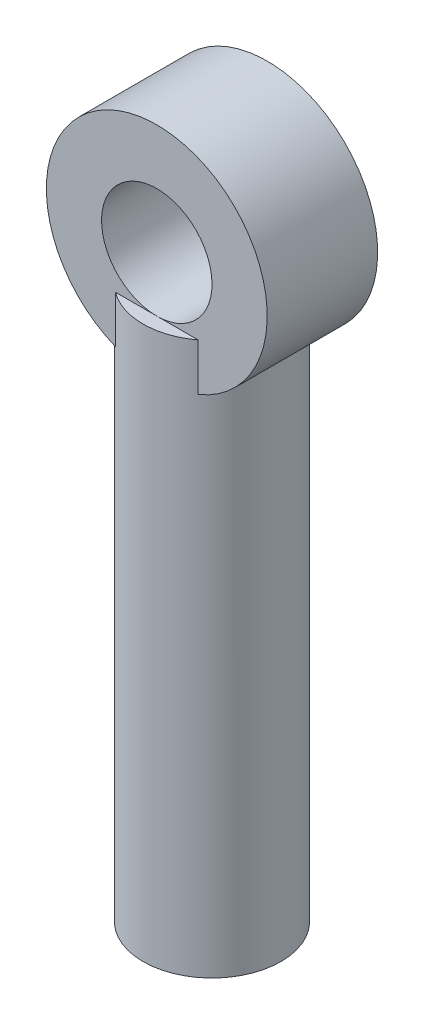
ISO-10303-21;
HEADER;
FILE_DESCRIPTION(('STEP AP214'),'2;1');
FILE_NAME('part.step','',(''),(''),'','','');
FILE_SCHEMA(('AUTOMOTIVE_DESIGN { 1 0 10303 214 1 1 1 1 }'));
ENDSEC;
DATA;
#1=APPLICATION_CONTEXT('core data for automotive mechanical design processes');
#2=APPLICATION_PROTOCOL_DEFINITION('international standard','automotive_design',2000,#1);
#3=PRODUCT_CONTEXT('',#1,'mechanical');
#4=PRODUCT('Part','Part','',(#3));
#5=PRODUCT_RELATED_PRODUCT_CATEGORY('part','',(#4));
#6=PRODUCT_DEFINITION_FORMATION('','',#4);
#7=PRODUCT_DEFINITION_CONTEXT('part definition',#1,'design');
#8=PRODUCT_DEFINITION('design','',#6,#7);
#9=PRODUCT_DEFINITION_SHAPE('','',#8);
#10=(LENGTH_UNIT() NAMED_UNIT(*) SI_UNIT(.MILLI.,.METRE.));
#11=(NAMED_UNIT(*) PLANE_ANGLE_UNIT() SI_UNIT($,.RADIAN.));
#12=(NAMED_UNIT(*) SI_UNIT($,.STERADIAN.) SOLID_ANGLE_UNIT());
#13=UNCERTAINTY_MEASURE_WITH_UNIT(LENGTH_MEASURE(1.E-05),#10,'distance_accuracy_value','');
#14=(GEOMETRIC_REPRESENTATION_CONTEXT(3) GLOBAL_UNCERTAINTY_ASSIGNED_CONTEXT((#13)) GLOBAL_UNIT_ASSIGNED_CONTEXT((#10,
#11,#12)) REPRESENTATION_CONTEXT('',''));
#15=CARTESIAN_POINT('',(0.,0.,0.));
#16=DIRECTION('',(0.,0.,1.));
#17=DIRECTION('',(1.,0.,0.));
#18=AXIS2_PLACEMENT_3D('',#15,#16,#17);
#19=CARTESIAN_POINT('',(0.,12.7,0.));
#20=DIRECTION('',(0.,1.,0.));
#21=DIRECTION('',(0.,0.,1.));
#22=AXIS2_PLACEMENT_3D('',#19,#20,#21);
#23=PLANE('',#22);
#24=CARTESIAN_POINT('',(0.,12.7,0.));
#25=DIRECTION('',(0.,1.,0.));
#26=DIRECTION('',(0.,0.,1.));
#27=AXIS2_PLACEMENT_3D('',#24,#25,#26);
#28=CIRCLE('',#27,1.5875);
#29=CARTESIAN_POINT('',(0.952500000000001,12.7,-1.27));
#30=VERTEX_POINT('',#29);
#31=CARTESIAN_POINT('',(-0.952500000000001,12.7,-1.27));
#32=VERTEX_POINT('',#31);
#33=EDGE_CURVE('E119',#30,#32,#28,.T.);
#34=ORIENTED_EDGE('',*,*,#33,.T.);
#35=DIRECTION('',(1.,0.,0.));
#36=VECTOR('',#35,1.);
#37=CARTESIAN_POINT('',(0.,12.7,-1.27));
#38=LINE('',#37,#36);
#39=CARTESIAN_POINT('',(0.,12.7,-1.27));
#40=VERTEX_POINT('',#39);
#41=EDGE_CURVE('E91',#32,#40,#38,.T.);
#42=ORIENTED_EDGE('',*,*,#41,.T.);
#43=EDGE_CURVE('E120',#40,#30,#38,.T.);
#44=ORIENTED_EDGE('',*,*,#43,.T.);
#45=EDGE_LOOP('',(#34,#42,#44));
#46=FACE_BOUND('',#45,.T.);
#47=ADVANCED_FACE('F32',(#46),#23,.T.);
#48=CARTESIAN_POINT('',(0.,12.7,0.));
#49=DIRECTION('',(0.,-1.,0.));
#50=DIRECTION('',(0.,0.,-1.));
#51=AXIS2_PLACEMENT_3D('',#48,#49,#50);
#52=CYLINDRICAL_SURFACE('',#51,1.5875);
#53=CARTESIAN_POINT('',(0.952500000000001,11.6153569803471,1.27));
#54=CARTESIAN_POINT('',(0.989655791020615,11.6303856882729,1.2421256315907));
#55=CARTESIAN_POINT('',(1.02544534645931,11.6458888225533,1.21274252950293));
#56=CARTESIAN_POINT('',(1.09419094910439,11.6774519982708,1.15110327226712));
#57=CARTESIAN_POINT('',(1.12714713693179,11.6935120120142,1.11884725986458));
#58=CARTESIAN_POINT('',(1.22215858205218,11.7422182305673,1.01740645175167));
#59=CARTESIAN_POINT('',(1.27971680265646,11.7751199598553,0.944030575818167));
#60=CARTESIAN_POINT('',(1.38170319671167,11.8378436858136,0.787289343166389));
#61=CARTESIAN_POINT('',(1.42610923071993,11.8676604351831,0.703907470810565));
#62=CARTESIAN_POINT('',(1.49983096529977,11.9195966414421,0.528772386160277));
#63=CARTESIAN_POINT('',(1.52921852577376,11.9417525854815,0.437061558613762));
#64=CARTESIAN_POINT('',(1.56528116038364,11.9695348912506,0.273853069129841));
#65=CARTESIAN_POINT('',(1.57597885540634,11.9780307620752,0.203728366997954));
#66=CARTESIAN_POINT('',(1.58786748495953,11.9874911178465,0.0621688829359988));
#67=CARTESIAN_POINT('',(1.5890636121949,11.9884597165189,-0.00926516202536795));
#68=CARTESIAN_POINT('',(1.58187506499033,11.9827183033471,-0.151274246830834));
#69=CARTESIAN_POINT('',(1.57349588403685,11.9760126942986,-0.221849755761965));
#70=CARTESIAN_POINT('',(1.54767109884845,11.9559058876037,-0.360337223782407));
#71=CARTESIAN_POINT('',(1.53021845129424,11.9424994887516,-0.428247069531047));
#72=CARTESIAN_POINT('',(1.48616804886478,11.9099813230483,-0.562735046242205));
#73=CARTESIAN_POINT('',(1.45923066503621,11.8906617462487,-0.629149721897692));
#74=CARTESIAN_POINT('',(1.39724824130627,11.8485135415832,-0.756907016648346));
#75=CARTESIAN_POINT('',(1.36219388968259,11.8256808937209,-0.818243699756027));
#76=CARTESIAN_POINT('',(1.27324561267795,11.7713904479607,-0.952491584171517));
#77=CARTESIAN_POINT('',(1.21684063141098,11.7393644019235,-1.02353478105292));
#78=CARTESIAN_POINT('',(1.12383524543901,11.6918843373157,-1.12213659464131));
#79=CARTESIAN_POINT('',(1.09145737494495,11.6761607750598,-1.15365893772766));
#80=CARTESIAN_POINT('',(1.0239904254824,11.6452592910852,-1.21393596126411));
#81=CARTESIAN_POINT('',(0.988901742133802,11.6300812902184,-1.2426910442017));
#82=CARTESIAN_POINT('',(0.952500000000001,11.6153569803471,-1.27));
#83=B_SPLINE_CURVE_WITH_KNOTS('',3,(#53,#54,#55,#56,#57,#58,#59,#60,#61,#62,#63,#64,#65,#66,#67,
#68,#69,#70,#71,#72,#73,#74,#75,#76,#77,#78,#79,#80,#81,#82),.UNSPECIFIED.,.F.,.F.,(4,2,2,2,2,2,
2,2,2,2,2,2,2,2,4),(0.,0.146355896107302,0.292704524322048,0.587907328091846,0.883604267004163,
1.1778727973786,1.39125693442266,1.60452444680448,1.81766966607226,2.03098058786609,
2.25287211450193,2.47501946567644,2.76219802328204,2.90560249126656,3.04898606999083),.UNSPECIFIED.);
#84=CARTESIAN_POINT('',(0.952500000000001,11.6153569803471,1.27));
#85=VERTEX_POINT('',#84);
#86=CARTESIAN_POINT('',(0.952500000000001,11.6153569803471,-1.27));
#87=VERTEX_POINT('',#86);
#88=EDGE_CURVE('E11',#85,#87,#83,.T.);
#89=ORIENTED_EDGE('',*,*,#88,.F.);
#90=DIRECTION('',(0.,-1.,0.));
#91=VECTOR('',#90,1.);
#92=CARTESIAN_POINT('',(0.952500000000001,12.7,1.27));
#93=LINE('',#92,#91);
#94=CARTESIAN_POINT('',(0.952500000000001,12.7,1.27));
#95=VERTEX_POINT('',#94);
#96=EDGE_CURVE('E110',#85,#95,#93,.F.);
#97=ORIENTED_EDGE('',*,*,#96,.T.);
#98=CARTESIAN_POINT('',(-0.952500000000001,12.7,1.27));
#99=VERTEX_POINT('',#98);
#100=EDGE_CURVE('E117',#99,#95,#28,.T.);
#101=ORIENTED_EDGE('',*,*,#100,.F.);
#102=DIRECTION('',(0.,-1.,0.));
#103=VECTOR('',#102,1.);
#104=CARTESIAN_POINT('',(-0.952500000000001,12.7,1.27));
#105=LINE('',#104,#103);
#106=CARTESIAN_POINT('',(-0.952500000000001,11.6153569803471,1.27));
#107=VERTEX_POINT('',#106);
#108=EDGE_CURVE('E60',#99,#107,#105,.T.);
#109=ORIENTED_EDGE('',*,*,#108,.T.);
#110=CARTESIAN_POINT('',(-0.952500000000001,11.6153569803471,-1.27));
#111=CARTESIAN_POINT('',(-0.989655791020615,11.6303856882729,-1.2421256315907));
#112=CARTESIAN_POINT('',(-1.02544534645931,11.6458888225533,-1.21274252950293));
#113=CARTESIAN_POINT('',(-1.09419094910439,11.6774519982708,-1.15110327226712));
#114=CARTESIAN_POINT('',(-1.12714713693179,11.6935120120142,-1.11884725986458));
#115=CARTESIAN_POINT('',(-1.22215858205218,11.7422182305673,-1.01740645175167));
#116=CARTESIAN_POINT('',(-1.27971680265646,11.7751199598553,-0.944030575818167));
#117=CARTESIAN_POINT('',(-1.38170319671167,11.8378436858136,-0.787289343166389));
#118=CARTESIAN_POINT('',(-1.42610923071993,11.8676604351831,-0.703907470810565));
#119=CARTESIAN_POINT('',(-1.49983096529977,11.9195966414421,-0.528772386160277));
#120=CARTESIAN_POINT('',(-1.52921852577376,11.9417525854815,-0.437061558613762));
#121=CARTESIAN_POINT('',(-1.56528116038364,11.9695348912506,-0.273853069129841));
#122=CARTESIAN_POINT('',(-1.57597885540634,11.9780307620752,-0.203728366997954));
#123=CARTESIAN_POINT('',(-1.58786748495953,11.9874911178465,-0.0621688829359988));
#124=CARTESIAN_POINT('',(-1.5890636121949,11.9884597165189,0.00926516202536795));
#125=CARTESIAN_POINT('',(-1.58187506499033,11.9827183033471,0.151274246830834));
#126=CARTESIAN_POINT('',(-1.57349588403685,11.9760126942986,0.221849755761965));
#127=CARTESIAN_POINT('',(-1.54767109884845,11.9559058876037,0.360337223782407));
#128=CARTESIAN_POINT('',(-1.53021845129424,11.9424994887516,0.428247069531047));
#129=CARTESIAN_POINT('',(-1.48616804886478,11.9099813230483,0.562735046242205));
#130=CARTESIAN_POINT('',(-1.45923066503621,11.8906617462487,0.629149721897692));
#131=CARTESIAN_POINT('',(-1.39724824130627,11.8485135415832,0.756907016648346));
#132=CARTESIAN_POINT('',(-1.36219388968259,11.8256808937209,0.818243699756027));
#133=CARTESIAN_POINT('',(-1.27324561267795,11.7713904479607,0.952491584171517));
#134=CARTESIAN_POINT('',(-1.21684063141098,11.7393644019235,1.02353478105292));
#135=CARTESIAN_POINT('',(-1.12383524543901,11.6918843373157,1.12213659464131));
#136=CARTESIAN_POINT('',(-1.09145737494495,11.6761607750598,1.15365893772766));
#137=CARTESIAN_POINT('',(-1.0239904254824,11.6452592910852,1.21393596126411));
#138=CARTESIAN_POINT('',(-0.988901742133802,11.6300812902184,1.2426910442017));
#139=CARTESIAN_POINT('',(-0.952500000000001,11.6153569803471,1.27));
#140=B_SPLINE_CURVE_WITH_KNOTS('',3,(#110,#111,#112,#113,#114,#115,#116,#117,#118,#119,#120,
#121,#122,#123,#124,#125,#126,#127,#128,#129,#130,#131,#132,#133,#134,#135,#136,#137,#138,#139),
.UNSPECIFIED.,.F.,.F.,(4,2,2,2,2,2,2,2,2,2,2,2,2,2,4),(0.,0.146355896107302,0.292704524322048,
0.587907328091846,0.883604267004163,1.1778727973786,1.39125693442266,1.60452444680448,
1.81766966607226,2.03098058786609,2.25287211450193,2.47501946567644,2.76219802328204,
2.90560249126656,3.04898606999083),.UNSPECIFIED.);
#141=CARTESIAN_POINT('',(-0.952500000000001,11.6153569803471,-1.27));
#142=VERTEX_POINT('',#141);
#143=EDGE_CURVE('E45',#142,#107,#140,.T.);
#144=ORIENTED_EDGE('',*,*,#143,.F.);
#145=DIRECTION('',(0.,-1.,0.));
#146=VECTOR('',#145,1.);
#147=CARTESIAN_POINT('',(-0.952500000000001,12.7,-1.27));
#148=LINE('',#147,#146);
#149=EDGE_CURVE('E108',#32,#142,#148,.T.);
#150=ORIENTED_EDGE('',*,*,#149,.F.);
#151=ORIENTED_EDGE('',*,*,#33,.F.);
#152=DIRECTION('',(0.,-1.,0.));
#153=VECTOR('',#152,1.);
#154=CARTESIAN_POINT('',(0.952500000000001,12.7,-1.27));
#155=LINE('',#154,#153);
#156=EDGE_CURVE('E52',#87,#30,#155,.F.);
#157=ORIENTED_EDGE('',*,*,#156,.F.);
#158=EDGE_LOOP('',(#89,#97,#101,#109,#144,#150,#151,#157));
#159=FACE_BOUND('',#158,.T.);
#160=CARTESIAN_POINT('',(0.,0.,0.));
#161=DIRECTION('',(0.,1.,0.));
#162=DIRECTION('',(0.,0.,1.));
#163=AXIS2_PLACEMENT_3D('',#160,#161,#162);
#164=CIRCLE('',#163,1.5875);
#165=CARTESIAN_POINT('',(0.,0.,1.5875));
#166=VERTEX_POINT('',#165);
#167=EDGE_CURVE('E114',#166,#166,#164,.T.);
#168=ORIENTED_EDGE('',*,*,#167,.T.);
#169=EDGE_LOOP('',(#168));
#170=FACE_BOUND('',#169,.T.);
#171=ADVANCED_FACE('F34',(#159,#170),#52,.T.);
#172=DIRECTION('',(1.,0.,0.));
#173=VECTOR('',#172,1.);
#174=CARTESIAN_POINT('',(0.,12.7,1.27));
#175=LINE('',#174,#173);
#176=CARTESIAN_POINT('',(0.,12.7,1.27));
#177=VERTEX_POINT('',#176);
#178=EDGE_CURVE('E83',#99,#177,#175,.T.);
#179=ORIENTED_EDGE('',*,*,#178,.F.);
#180=ORIENTED_EDGE('',*,*,#100,.T.);
#181=EDGE_CURVE('E93',#177,#95,#175,.T.);
#182=ORIENTED_EDGE('',*,*,#181,.F.);
#183=EDGE_LOOP('',(#179,#180,#182));
#184=FACE_BOUND('',#183,.T.);
#185=ADVANCED_FACE('F134',(#184),#23,.T.);
#186=CARTESIAN_POINT('',(0.,0.,0.));
#187=DIRECTION('',(0.,1.,0.));
#188=DIRECTION('',(0.,0.,1.));
#189=AXIS2_PLACEMENT_3D('',#186,#187,#188);
#190=PLANE('',#189);
#191=ORIENTED_EDGE('',*,*,#167,.F.);
#192=EDGE_LOOP('',(#191));
#193=FACE_BOUND('',#192,.T.);
#194=ADVANCED_FACE('F129',(#193),#190,.F.);
#195=CARTESIAN_POINT('',(0.,13.97,1.27));
#196=DIRECTION('',(0.,0.,-1.));
#197=DIRECTION('',(-1.,0.,0.));
#198=AXIS2_PLACEMENT_3D('',#195,#196,#197);
#199=CYLINDRICAL_SURFACE('',#198,2.54);
#200=CARTESIAN_POINT('',(0.,13.97,1.27));
#201=DIRECTION('',(0.,0.,1.));
#202=DIRECTION('',(1.,0.,0.));
#203=AXIS2_PLACEMENT_3D('',#200,#201,#202);
#204=CIRCLE('',#203,2.54);
#205=EDGE_CURVE('E101',#85,#107,#204,.T.);
#206=ORIENTED_EDGE('',*,*,#205,.F.);
#207=ORIENTED_EDGE('',*,*,#88,.T.);
#208=CARTESIAN_POINT('',(0.,13.97,-1.27));
#209=DIRECTION('',(0.,0.,1.));
#210=DIRECTION('',(1.,0.,0.));
#211=AXIS2_PLACEMENT_3D('',#208,#209,#210);
#212=CIRCLE('',#211,2.54);
#213=EDGE_CURVE('E97',#87,#142,#212,.T.);
#214=ORIENTED_EDGE('',*,*,#213,.T.);
#215=ORIENTED_EDGE('',*,*,#143,.T.);
#216=EDGE_LOOP('',(#206,#207,#214,#215));
#217=FACE_BOUND('',#216,.T.);
#218=ADVANCED_FACE('F124',(#217),#199,.T.);
#219=CARTESIAN_POINT('',(0.,13.97,1.27));
#220=DIRECTION('',(0.,0.,1.));
#221=DIRECTION('',(1.,0.,0.));
#222=AXIS2_PLACEMENT_3D('',#219,#220,#221);
#223=PLANE('',#222);
#224=ORIENTED_EDGE('',*,*,#108,.F.);
#225=ORIENTED_EDGE('',*,*,#178,.T.);
#226=CARTESIAN_POINT('',(0.,13.97,1.27));
#227=DIRECTION('',(0.,0.,1.));
#228=DIRECTION('',(1.,0.,0.));
#229=AXIS2_PLACEMENT_3D('',#226,#227,#228);
#230=CIRCLE('',#229,1.27);
#231=EDGE_CURVE('E86',#177,#177,#230,.T.);
#232=ORIENTED_EDGE('',*,*,#231,.F.);
#233=ORIENTED_EDGE('',*,*,#181,.T.);
#234=ORIENTED_EDGE('',*,*,#96,.F.);
#235=ORIENTED_EDGE('',*,*,#205,.T.);
#236=EDGE_LOOP('',(#224,#225,#232,#233,#234,#235));
#237=FACE_BOUND('',#236,.T.);
#238=ADVANCED_FACE('F85',(#237),#223,.T.);
#239=CARTESIAN_POINT('',(0.,13.97,-1.27));
#240=DIRECTION('',(0.,0.,1.));
#241=DIRECTION('',(1.,0.,0.));
#242=AXIS2_PLACEMENT_3D('',#239,#240,#241);
#243=PLANE('',#242);
#244=ORIENTED_EDGE('',*,*,#41,.F.);
#245=ORIENTED_EDGE('',*,*,#149,.T.);
#246=ORIENTED_EDGE('',*,*,#213,.F.);
#247=ORIENTED_EDGE('',*,*,#156,.T.);
#248=ORIENTED_EDGE('',*,*,#43,.F.);
#249=CARTESIAN_POINT('',(0.,13.97,-1.27));
#250=DIRECTION('',(0.,0.,1.));
#251=DIRECTION('',(1.,0.,0.));
#252=AXIS2_PLACEMENT_3D('',#249,#250,#251);
#253=CIRCLE('',#252,1.27);
#254=EDGE_CURVE('E98',#40,#40,#253,.T.);
#255=ORIENTED_EDGE('',*,*,#254,.T.);
#256=EDGE_LOOP('',(#244,#245,#246,#247,#248,#255));
#257=FACE_BOUND('',#256,.T.);
#258=ADVANCED_FACE('F152',(#257),#243,.F.);
#259=CARTESIAN_POINT('',(0.,13.97,1.27));
#260=DIRECTION('',(0.,0.,-1.));
#261=DIRECTION('',(-1.,0.,0.));
#262=AXIS2_PLACEMENT_3D('',#259,#260,#261);
#263=CYLINDRICAL_SURFACE('',#262,1.27);
#264=ORIENTED_EDGE('',*,*,#231,.T.);
#265=EDGE_LOOP('',(#264));
#266=FACE_BOUND('',#265,.T.);
#267=ORIENTED_EDGE('',*,*,#254,.F.);
#268=EDGE_LOOP('',(#267));
#269=FACE_BOUND('',#268,.T.);
#270=ADVANCED_FACE('F95',(#266,#269),#263,.F.);
#271=CLOSED_SHELL('',(#47,#171,#185,#194,#218,#238,#258,#270));
#272=MANIFOLD_SOLID_BREP('B2',#271);
#273=ADVANCED_BREP_SHAPE_REPRESENTATION('',(#18,#272),#14);
#274=SHAPE_DEFINITION_REPRESENTATION(#9,#273);
ENDSEC;
END-ISO-10303-21;
